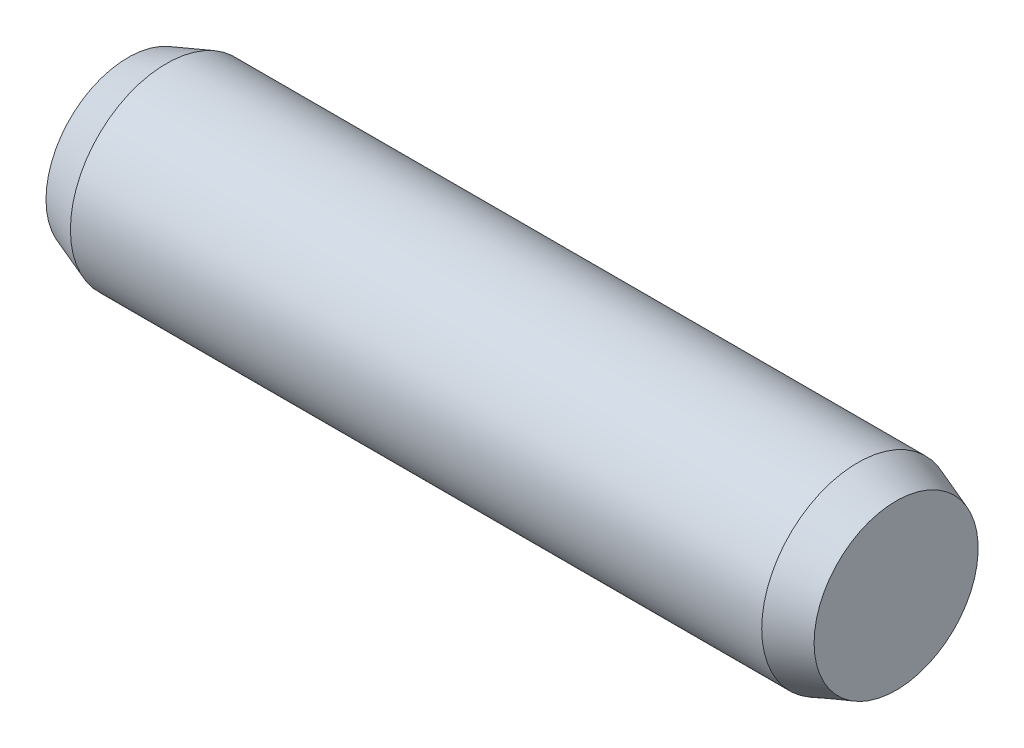
ISO-10303-21;
HEADER;
FILE_DESCRIPTION(('STEP AP214'),'2;1');
FILE_NAME('part.step','',(''),(''),'','','');
FILE_SCHEMA(('AUTOMOTIVE_DESIGN { 1 0 10303 214 1 1 1 1 }'));
ENDSEC;
DATA;
#1=APPLICATION_CONTEXT('core data for automotive mechanical design processes');
#2=APPLICATION_PROTOCOL_DEFINITION('international standard','automotive_design',2000,#1);
#3=PRODUCT_CONTEXT('',#1,'mechanical');
#4=PRODUCT('Part','Part','',(#3));
#5=PRODUCT_RELATED_PRODUCT_CATEGORY('part','',(#4));
#6=PRODUCT_DEFINITION_FORMATION('','',#4);
#7=PRODUCT_DEFINITION_CONTEXT('part definition',#1,'design');
#8=PRODUCT_DEFINITION('design','',#6,#7);
#9=PRODUCT_DEFINITION_SHAPE('','',#8);
#10=(LENGTH_UNIT() NAMED_UNIT(*) SI_UNIT(.MILLI.,.METRE.));
#11=(NAMED_UNIT(*) PLANE_ANGLE_UNIT() SI_UNIT($,.RADIAN.));
#12=(NAMED_UNIT(*) SI_UNIT($,.STERADIAN.) SOLID_ANGLE_UNIT());
#13=UNCERTAINTY_MEASURE_WITH_UNIT(LENGTH_MEASURE(1.E-05),#10,'distance_accuracy_value','');
#14=(GEOMETRIC_REPRESENTATION_CONTEXT(3) GLOBAL_UNCERTAINTY_ASSIGNED_CONTEXT((#13)) GLOBAL_UNIT_ASSIGNED_CONTEXT((#10,
#11,#12)) REPRESENTATION_CONTEXT('',''));
#15=CARTESIAN_POINT('',(0.,0.,0.));
#16=DIRECTION('',(0.,0.,1.));
#17=DIRECTION('',(1.,0.,0.));
#18=AXIS2_PLACEMENT_3D('',#15,#16,#17);
#19=CARTESIAN_POINT('',(0.,0.,0.));
#20=DIRECTION('',(1.,0.,0.));
#21=DIRECTION('',(0.,0.,-1.));
#22=AXIS2_PLACEMENT_3D('',#19,#20,#21);
#23=PLANE('',#22);
#24=CARTESIAN_POINT('',(0.,0.,0.));
#25=DIRECTION('',(-1.,0.,0.));
#26=DIRECTION('',(0.,0.,1.));
#27=AXIS2_PLACEMENT_3D('',#24,#25,#26);
#28=CIRCLE('',#27,1.28161785944028);
#29=CARTESIAN_POINT('',(0.,0.,1.28161785944028));
#30=VERTEX_POINT('',#29);
#31=EDGE_CURVE('E10',#30,#30,#28,.T.);
#32=ORIENTED_EDGE('',*,*,#31,.T.);
#33=EDGE_LOOP('',(#32));
#34=FACE_BOUND('',#33,.T.);
#35=ADVANCED_FACE('F34',(#34),#23,.F.);
#36=CARTESIAN_POINT('',(0.600000000000004,0.,0.));
#37=DIRECTION('',(1.,0.,0.));
#38=DIRECTION('',(0.,0.,-1.));
#39=AXIS2_PLACEMENT_3D('',#36,#37,#38);
#40=CONICAL_SURFACE('',#39,1.5,0.349065850398866);
#41=ORIENTED_EDGE('',*,*,#31,.F.);
#42=EDGE_LOOP('',(#41));
#43=FACE_BOUND('',#42,.T.);
#44=CARTESIAN_POINT('',(0.600000000000004,0.,0.));
#45=DIRECTION('',(-1.,0.,0.));
#46=DIRECTION('',(0.,0.,1.));
#47=AXIS2_PLACEMENT_3D('',#44,#45,#46);
#48=CIRCLE('',#47,1.5);
#49=CARTESIAN_POINT('',(0.600000000000004,0.,1.5));
#50=VERTEX_POINT('',#49);
#51=EDGE_CURVE('E40',#50,#50,#48,.T.);
#52=ORIENTED_EDGE('',*,*,#51,.T.);
#53=EDGE_LOOP('',(#52));
#54=FACE_BOUND('',#53,.T.);
#55=ADVANCED_FACE('F66',(#43,#54),#40,.T.);
#56=CARTESIAN_POINT('',(0.,0.,0.));
#57=DIRECTION('',(-1.,0.,0.));
#58=DIRECTION('',(0.,0.,1.));
#59=AXIS2_PLACEMENT_3D('',#56,#57,#58);
#60=CYLINDRICAL_SURFACE('',#59,1.5);
#61=ORIENTED_EDGE('',*,*,#51,.F.);
#62=EDGE_LOOP('',(#61));
#63=FACE_BOUND('',#62,.T.);
#64=CARTESIAN_POINT('',(11.4,0.,0.));
#65=DIRECTION('',(-1.,0.,0.));
#66=DIRECTION('',(0.,0.,1.));
#67=AXIS2_PLACEMENT_3D('',#64,#65,#66);
#68=CIRCLE('',#67,1.5);
#69=CARTESIAN_POINT('',(11.4,0.,1.5));
#70=VERTEX_POINT('',#69);
#71=EDGE_CURVE('E44',#70,#70,#68,.T.);
#72=ORIENTED_EDGE('',*,*,#71,.T.);
#73=EDGE_LOOP('',(#72));
#74=FACE_BOUND('',#73,.T.);
#75=ADVANCED_FACE('F62',(#63,#74),#60,.T.);
#76=CARTESIAN_POINT('',(12.,0.,0.));
#77=DIRECTION('',(-1.,0.,0.));
#78=DIRECTION('',(0.,0.,1.));
#79=AXIS2_PLACEMENT_3D('',#76,#77,#78);
#80=CONICAL_SURFACE('',#79,1.28161785944028,0.349065850398867);
#81=ORIENTED_EDGE('',*,*,#71,.F.);
#82=EDGE_LOOP('',(#81));
#83=FACE_BOUND('',#82,.T.);
#84=CARTESIAN_POINT('',(12.,0.,0.));
#85=DIRECTION('',(-1.,0.,0.));
#86=DIRECTION('',(0.,0.,1.));
#87=AXIS2_PLACEMENT_3D('',#84,#85,#86);
#88=CIRCLE('',#87,1.28161785944028);
#89=CARTESIAN_POINT('',(12.,0.,1.28161785944028));
#90=VERTEX_POINT('',#89);
#91=EDGE_CURVE('E48',#90,#90,#88,.T.);
#92=ORIENTED_EDGE('',*,*,#91,.T.);
#93=EDGE_LOOP('',(#92));
#94=FACE_BOUND('',#93,.T.);
#95=ADVANCED_FACE('F54',(#83,#94),#80,.T.);
#96=CARTESIAN_POINT('',(12.,1.28161785944028,0.));
#97=DIRECTION('',(-1.,0.,0.));
#98=DIRECTION('',(0.,0.,1.));
#99=AXIS2_PLACEMENT_3D('',#96,#97,#98);
#100=PLANE('',#99);
#101=ORIENTED_EDGE('',*,*,#91,.F.);
#102=EDGE_LOOP('',(#101));
#103=FACE_BOUND('',#102,.T.);
#104=ADVANCED_FACE('F56',(#103),#100,.F.);
#105=CLOSED_SHELL('',(#35,#55,#75,#95,#104));
#106=MANIFOLD_SOLID_BREP('B2',#105);
#107=ADVANCED_BREP_SHAPE_REPRESENTATION('',(#18,#106),#14);
#108=SHAPE_DEFINITION_REPRESENTATION(#9,#107);
ENDSEC;
END-ISO-10303-21;
